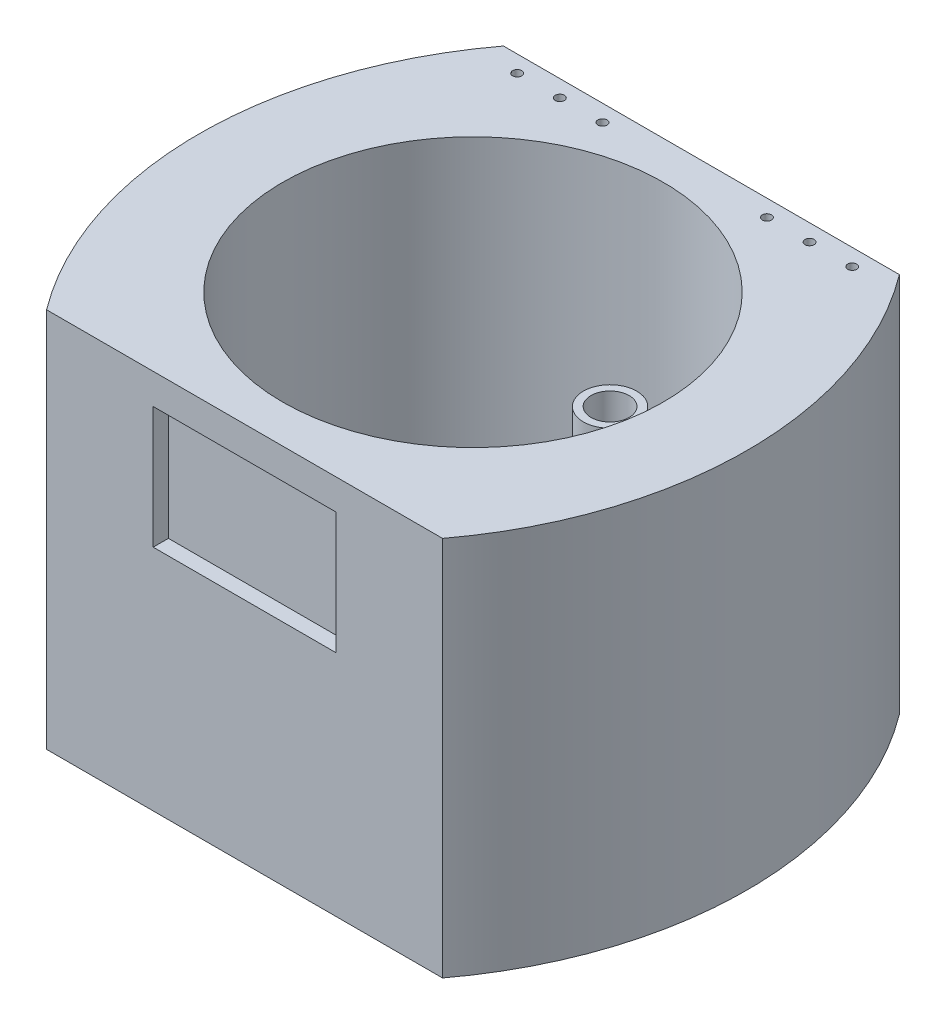
ISO-10303-21;
HEADER;
FILE_DESCRIPTION(('STEP AP214'),'2;1');
FILE_NAME('part.step','',(''),(''),'','','');
FILE_SCHEMA(('AUTOMOTIVE_DESIGN { 1 0 10303 214 1 1 1 1 }'));
ENDSEC;
DATA;
#1=APPLICATION_CONTEXT('core data for automotive mechanical design processes');
#2=APPLICATION_PROTOCOL_DEFINITION('international standard','automotive_design',2000,#1);
#3=PRODUCT_CONTEXT('',#1,'mechanical');
#4=PRODUCT('Part','Part','',(#3));
#5=PRODUCT_RELATED_PRODUCT_CATEGORY('part','',(#4));
#6=PRODUCT_DEFINITION_FORMATION('','',#4);
#7=PRODUCT_DEFINITION_CONTEXT('part definition',#1,'design');
#8=PRODUCT_DEFINITION('design','',#6,#7);
#9=PRODUCT_DEFINITION_SHAPE('','',#8);
#10=(LENGTH_UNIT() NAMED_UNIT(*) SI_UNIT(.MILLI.,.METRE.));
#11=(NAMED_UNIT(*) PLANE_ANGLE_UNIT() SI_UNIT($,.RADIAN.));
#12=(NAMED_UNIT(*) SI_UNIT($,.STERADIAN.) SOLID_ANGLE_UNIT());
#13=UNCERTAINTY_MEASURE_WITH_UNIT(LENGTH_MEASURE(1.E-05),#10,'distance_accuracy_value','');
#14=(GEOMETRIC_REPRESENTATION_CONTEXT(3) GLOBAL_UNCERTAINTY_ASSIGNED_CONTEXT((#13)) GLOBAL_UNIT_ASSIGNED_CONTEXT((#10,
#11,#12)) REPRESENTATION_CONTEXT('',''));
#15=CARTESIAN_POINT('',(0.,0.,0.));
#16=DIRECTION('',(0.,0.,1.));
#17=DIRECTION('',(1.,0.,0.));
#18=AXIS2_PLACEMENT_3D('',#15,#16,#17);
#19=CARTESIAN_POINT('',(70.,250.,0.));
#20=DIRECTION('',(0.,-1.,0.));
#21=DIRECTION('',(0.,0.,-1.));
#22=AXIS2_PLACEMENT_3D('',#19,#20,#21);
#23=CYLINDRICAL_SURFACE('',#22,250.);
#24=CARTESIAN_POINT('',(70.,0.,0.));
#25=DIRECTION('',(0.,1.,0.));
#26=DIRECTION('',(0.,0.,1.));
#27=AXIS2_PLACEMENT_3D('',#24,#25,#26);
#28=CIRCLE('',#27,250.);
#29=CARTESIAN_POINT('',(-130.,0.,-150.));
#30=VERTEX_POINT('',#29);
#31=CARTESIAN_POINT('',(-130.,0.,150.));
#32=VERTEX_POINT('',#31);
#33=EDGE_CURVE('E177',#30,#32,#28,.T.);
#34=ORIENTED_EDGE('',*,*,#33,.T.);
#35=DIRECTION('',(0.,-1.,0.));
#36=VECTOR('',#35,1.);
#37=CARTESIAN_POINT('',(-130.,250.,150.));
#38=LINE('',#37,#36);
#39=CARTESIAN_POINT('',(-130.,250.,150.));
#40=VERTEX_POINT('',#39);
#41=EDGE_CURVE('E11',#40,#32,#38,.T.);
#42=ORIENTED_EDGE('',*,*,#41,.F.);
#43=CARTESIAN_POINT('',(70.,250.,0.));
#44=DIRECTION('',(0.,1.,0.));
#45=DIRECTION('',(0.,0.,1.));
#46=AXIS2_PLACEMENT_3D('',#43,#44,#45);
#47=CIRCLE('',#46,250.);
#48=CARTESIAN_POINT('',(-130.,250.,-150.));
#49=VERTEX_POINT('',#48);
#50=EDGE_CURVE('E181',#49,#40,#47,.T.);
#51=ORIENTED_EDGE('',*,*,#50,.F.);
#52=DIRECTION('',(0.,-1.,0.));
#53=VECTOR('',#52,1.);
#54=CARTESIAN_POINT('',(-130.,250.,-150.));
#55=LINE('',#54,#53);
#56=EDGE_CURVE('E191',#49,#30,#55,.T.);
#57=ORIENTED_EDGE('',*,*,#56,.T.);
#58=EDGE_LOOP('',(#34,#42,#51,#57));
#59=FACE_BOUND('',#58,.T.);
#60=ADVANCED_FACE('F44',(#59),#23,.T.);
#61=CARTESIAN_POINT('',(-130.,250.,150.));
#62=DIRECTION('',(0.,0.,-1.));
#63=DIRECTION('',(-1.,0.,0.));
#64=AXIS2_PLACEMENT_3D('',#61,#62,#63);
#65=PLANE('',#64);
#66=DIRECTION('',(1.,0.,0.));
#67=VECTOR('',#66,1.);
#68=CARTESIAN_POINT('',(-59.9999999999986,150.,150.));
#69=LINE('',#68,#67);
#70=CARTESIAN_POINT('',(-59.9999999999986,150.,150.));
#71=VERTEX_POINT('',#70);
#72=CARTESIAN_POINT('',(60.0000000000014,150.,150.));
#73=VERTEX_POINT('',#72);
#74=EDGE_CURVE('E157',#71,#73,#69,.T.);
#75=ORIENTED_EDGE('',*,*,#74,.F.);
#76=DIRECTION('',(0.,-1.,0.));
#77=VECTOR('',#76,1.);
#78=CARTESIAN_POINT('',(-59.9999999999986,230.,150.));
#79=LINE('',#78,#77);
#80=CARTESIAN_POINT('',(-59.9999999999986,230.,150.));
#81=VERTEX_POINT('',#80);
#82=EDGE_CURVE('E59',#81,#71,#79,.T.);
#83=ORIENTED_EDGE('',*,*,#82,.F.);
#84=DIRECTION('',(-1.,0.,0.));
#85=VECTOR('',#84,1.);
#86=CARTESIAN_POINT('',(-59.9999999999986,230.,150.));
#87=LINE('',#86,#85);
#88=CARTESIAN_POINT('',(60.0000000000014,230.,150.));
#89=VERTEX_POINT('',#88);
#90=EDGE_CURVE('E141',#89,#81,#87,.T.);
#91=ORIENTED_EDGE('',*,*,#90,.F.);
#92=DIRECTION('',(0.,1.,0.));
#93=VECTOR('',#92,1.);
#94=CARTESIAN_POINT('',(60.0000000000014,230.,150.));
#95=LINE('',#94,#93);
#96=EDGE_CURVE('E145',#73,#89,#95,.T.);
#97=ORIENTED_EDGE('',*,*,#96,.F.);
#98=EDGE_LOOP('',(#75,#83,#91,#97));
#99=FACE_BOUND('',#98,.T.);
#100=DIRECTION('',(1.,0.,0.));
#101=VECTOR('',#100,1.);
#102=CARTESIAN_POINT('',(-130.,0.,150.));
#103=LINE('',#102,#101);
#104=CARTESIAN_POINT('',(130.,0.,150.));
#105=VERTEX_POINT('',#104);
#106=EDGE_CURVE('E195',#32,#105,#103,.T.);
#107=ORIENTED_EDGE('',*,*,#106,.T.);
#108=DIRECTION('',(0.,-1.,0.));
#109=VECTOR('',#108,1.);
#110=CARTESIAN_POINT('',(130.,250.,150.));
#111=LINE('',#110,#109);
#112=CARTESIAN_POINT('',(130.,250.,150.));
#113=VERTEX_POINT('',#112);
#114=EDGE_CURVE('E52',#113,#105,#111,.T.);
#115=ORIENTED_EDGE('',*,*,#114,.F.);
#116=DIRECTION('',(1.,0.,0.));
#117=VECTOR('',#116,1.);
#118=CARTESIAN_POINT('',(-130.,250.,150.));
#119=LINE('',#118,#117);
#120=EDGE_CURVE('E96',#40,#113,#119,.T.);
#121=ORIENTED_EDGE('',*,*,#120,.F.);
#122=ORIENTED_EDGE('',*,*,#41,.T.);
#123=EDGE_LOOP('',(#107,#115,#121,#122));
#124=FACE_BOUND('',#123,.T.);
#125=ADVANCED_FACE('F230',(#99,#124),#65,.F.);
#126=CARTESIAN_POINT('',(-70.,250.,0.));
#127=DIRECTION('',(0.,-1.,0.));
#128=DIRECTION('',(0.,0.,-1.));
#129=AXIS2_PLACEMENT_3D('',#126,#127,#128);
#130=CYLINDRICAL_SURFACE('',#129,250.);
#131=CARTESIAN_POINT('',(-70.,0.,0.));
#132=DIRECTION('',(0.,1.,0.));
#133=DIRECTION('',(0.,0.,-1.));
#134=AXIS2_PLACEMENT_3D('',#131,#132,#133);
#135=CIRCLE('',#134,250.);
#136=CARTESIAN_POINT('',(130.,0.,-150.));
#137=VERTEX_POINT('',#136);
#138=EDGE_CURVE('E198',#105,#137,#135,.T.);
#139=ORIENTED_EDGE('',*,*,#138,.T.);
#140=DIRECTION('',(0.,-1.,0.));
#141=VECTOR('',#140,1.);
#142=CARTESIAN_POINT('',(130.,250.,-150.));
#143=LINE('',#142,#141);
#144=CARTESIAN_POINT('',(130.,250.,-150.));
#145=VERTEX_POINT('',#144);
#146=EDGE_CURVE('E205',#145,#137,#143,.T.);
#147=ORIENTED_EDGE('',*,*,#146,.F.);
#148=CARTESIAN_POINT('',(-70.,250.,0.));
#149=DIRECTION('',(0.,1.,0.));
#150=DIRECTION('',(0.,0.,-1.));
#151=AXIS2_PLACEMENT_3D('',#148,#149,#150);
#152=CIRCLE('',#151,250.);
#153=EDGE_CURVE('E186',#113,#145,#152,.T.);
#154=ORIENTED_EDGE('',*,*,#153,.F.);
#155=ORIENTED_EDGE('',*,*,#114,.T.);
#156=EDGE_LOOP('',(#139,#147,#154,#155));
#157=FACE_BOUND('',#156,.T.);
#158=ADVANCED_FACE('F212',(#157),#130,.T.);
#159=CARTESIAN_POINT('',(-130.,250.,-150.));
#160=DIRECTION('',(0.,0.,1.));
#161=DIRECTION('',(1.,0.,0.));
#162=AXIS2_PLACEMENT_3D('',#159,#160,#161);
#163=PLANE('',#162);
#164=DIRECTION('',(-1.,0.,0.));
#165=VECTOR('',#164,1.);
#166=CARTESIAN_POINT('',(-130.,0.,-150.));
#167=LINE('',#166,#165);
#168=EDGE_CURVE('E89',#137,#30,#167,.T.);
#169=ORIENTED_EDGE('',*,*,#168,.T.);
#170=ORIENTED_EDGE('',*,*,#56,.F.);
#171=DIRECTION('',(-1.,0.,0.));
#172=VECTOR('',#171,1.);
#173=CARTESIAN_POINT('',(-130.,250.,-150.));
#174=LINE('',#173,#172);
#175=EDGE_CURVE('E68',#145,#49,#174,.T.);
#176=ORIENTED_EDGE('',*,*,#175,.F.);
#177=ORIENTED_EDGE('',*,*,#146,.T.);
#178=EDGE_LOOP('',(#169,#170,#176,#177));
#179=FACE_BOUND('',#178,.T.);
#180=ADVANCED_FACE('F220',(#179),#163,.F.);
#181=CARTESIAN_POINT('',(70.,250.,0.));
#182=DIRECTION('',(0.,1.,0.));
#183=DIRECTION('',(0.,0.,1.));
#184=AXIS2_PLACEMENT_3D('',#181,#182,#183);
#185=PLANE('',#184);
#186=CARTESIAN_POINT('',(-110.,250.,-139.));
#187=DIRECTION('',(0.,1.,0.));
#188=DIRECTION('',(0.,0.,1.));
#189=AXIS2_PLACEMENT_3D('',#186,#187,#188);
#190=CIRCLE('',#189,3.00000000000001);
#191=CARTESIAN_POINT('',(-110.,250.,-136.));
#192=VERTEX_POINT('',#191);
#193=EDGE_CURVE('E302',#192,#192,#190,.T.);
#194=ORIENTED_EDGE('',*,*,#193,.F.);
#195=EDGE_LOOP('',(#194));
#196=FACE_BOUND('',#195,.T.);
#197=CARTESIAN_POINT('',(-82.,250.,-139.));
#198=DIRECTION('',(0.,1.,0.));
#199=DIRECTION('',(0.,0.,1.));
#200=AXIS2_PLACEMENT_3D('',#197,#198,#199);
#201=CIRCLE('',#200,3.00000000000001);
#202=CARTESIAN_POINT('',(-82.,250.,-136.));
#203=VERTEX_POINT('',#202);
#204=EDGE_CURVE('E306',#203,#203,#201,.T.);
#205=ORIENTED_EDGE('',*,*,#204,.F.);
#206=EDGE_LOOP('',(#205));
#207=FACE_BOUND('',#206,.T.);
#208=CARTESIAN_POINT('',(-54.,250.,-139.));
#209=DIRECTION('',(0.,1.,0.));
#210=DIRECTION('',(0.,0.,1.));
#211=AXIS2_PLACEMENT_3D('',#208,#209,#210);
#212=CIRCLE('',#211,2.99999999999999);
#213=CARTESIAN_POINT('',(-54.,250.,-136.));
#214=VERTEX_POINT('',#213);
#215=EDGE_CURVE('E314',#214,#214,#212,.T.);
#216=ORIENTED_EDGE('',*,*,#215,.F.);
#217=EDGE_LOOP('',(#216));
#218=FACE_BOUND('',#217,.T.);
#219=CARTESIAN_POINT('',(54.,250.,-139.));
#220=DIRECTION('',(0.,1.,0.));
#221=DIRECTION('',(0.,0.,1.));
#222=AXIS2_PLACEMENT_3D('',#219,#220,#221);
#223=CIRCLE('',#222,3.00000000000001);
#224=CARTESIAN_POINT('',(54.,250.,-136.));
#225=VERTEX_POINT('',#224);
#226=EDGE_CURVE('E322',#225,#225,#223,.T.);
#227=ORIENTED_EDGE('',*,*,#226,.F.);
#228=EDGE_LOOP('',(#227));
#229=FACE_BOUND('',#228,.T.);
#230=CARTESIAN_POINT('',(82.,250.,-139.));
#231=DIRECTION('',(0.,1.,0.));
#232=DIRECTION('',(0.,0.,1.));
#233=AXIS2_PLACEMENT_3D('',#230,#231,#232);
#234=CIRCLE('',#233,3.00000000000001);
#235=CARTESIAN_POINT('',(82.,250.,-136.));
#236=VERTEX_POINT('',#235);
#237=EDGE_CURVE('E330',#236,#236,#234,.T.);
#238=ORIENTED_EDGE('',*,*,#237,.F.);
#239=EDGE_LOOP('',(#238));
#240=FACE_BOUND('',#239,.T.);
#241=CARTESIAN_POINT('',(110.,250.,-139.));
#242=DIRECTION('',(0.,1.,0.));
#243=DIRECTION('',(0.,0.,1.));
#244=AXIS2_PLACEMENT_3D('',#241,#242,#243);
#245=CIRCLE('',#244,3.00000000000001);
#246=CARTESIAN_POINT('',(110.,250.,-136.));
#247=VERTEX_POINT('',#246);
#248=EDGE_CURVE('E292',#247,#247,#245,.T.);
#249=ORIENTED_EDGE('',*,*,#248,.F.);
#250=EDGE_LOOP('',(#249));
#251=FACE_BOUND('',#250,.T.);
#252=CARTESIAN_POINT('',(0.,250.,0.));
#253=DIRECTION('',(0.,1.,0.));
#254=DIRECTION('',(0.,0.,1.));
#255=AXIS2_PLACEMENT_3D('',#252,#253,#254);
#256=CIRCLE('',#255,125.);
#257=CARTESIAN_POINT('',(0.,250.,125.));
#258=VERTEX_POINT('',#257);
#259=EDGE_CURVE('E167',#258,#258,#256,.T.);
#260=ORIENTED_EDGE('',*,*,#259,.F.);
#261=EDGE_LOOP('',(#260));
#262=FACE_BOUND('',#261,.T.);
#263=ORIENTED_EDGE('',*,*,#50,.T.);
#264=ORIENTED_EDGE('',*,*,#120,.T.);
#265=ORIENTED_EDGE('',*,*,#153,.T.);
#266=ORIENTED_EDGE('',*,*,#175,.T.);
#267=EDGE_LOOP('',(#263,#264,#265,#266));
#268=FACE_BOUND('',#267,.T.);
#269=ADVANCED_FACE('F222',(#196,#207,#218,#229,#240,#251,#262,#268),#185,.T.);
#270=CARTESIAN_POINT('',(70.,0.,0.));
#271=DIRECTION('',(0.,1.,0.));
#272=DIRECTION('',(0.,0.,1.));
#273=AXIS2_PLACEMENT_3D('',#270,#271,#272);
#274=PLANE('',#273);
#275=CARTESIAN_POINT('',(-82.5,0.,40.));
#276=DIRECTION('',(0.,1.,0.));
#277=DIRECTION('',(0.,0.,1.));
#278=AXIS2_PLACEMENT_3D('',#275,#276,#277);
#279=CIRCLE('',#278,3.50000000000001);
#280=CARTESIAN_POINT('',(-82.5,0.,43.5));
#281=VERTEX_POINT('',#280);
#282=EDGE_CURVE('E273',#281,#281,#279,.T.);
#283=ORIENTED_EDGE('',*,*,#282,.T.);
#284=EDGE_LOOP('',(#283));
#285=FACE_BOUND('',#284,.T.);
#286=CARTESIAN_POINT('',(37.5,0.,40.));
#287=DIRECTION('',(0.,1.,0.));
#288=DIRECTION('',(0.,0.,1.));
#289=AXIS2_PLACEMENT_3D('',#286,#287,#288);
#290=CIRCLE('',#289,3.5);
#291=CARTESIAN_POINT('',(37.5,0.,43.5));
#292=VERTEX_POINT('',#291);
#293=EDGE_CURVE('E277',#292,#292,#290,.T.);
#294=ORIENTED_EDGE('',*,*,#293,.T.);
#295=EDGE_LOOP('',(#294));
#296=FACE_BOUND('',#295,.T.);
#297=CARTESIAN_POINT('',(37.5,0.,-40.));
#298=DIRECTION('',(0.,1.,0.));
#299=DIRECTION('',(0.,0.,1.));
#300=AXIS2_PLACEMENT_3D('',#297,#298,#299);
#301=CIRCLE('',#300,3.5);
#302=CARTESIAN_POINT('',(37.5,0.,-36.5));
#303=VERTEX_POINT('',#302);
#304=EDGE_CURVE('E281',#303,#303,#301,.T.);
#305=ORIENTED_EDGE('',*,*,#304,.T.);
#306=EDGE_LOOP('',(#305));
#307=FACE_BOUND('',#306,.T.);
#308=CARTESIAN_POINT('',(-82.5,0.,-40.));
#309=DIRECTION('',(0.,1.,0.));
#310=DIRECTION('',(0.,0.,1.));
#311=AXIS2_PLACEMENT_3D('',#308,#309,#310);
#312=CIRCLE('',#311,3.50000000000001);
#313=CARTESIAN_POINT('',(-82.5,0.,-36.5));
#314=VERTEX_POINT('',#313);
#315=EDGE_CURVE('E284',#314,#314,#312,.T.);
#316=ORIENTED_EDGE('',*,*,#315,.T.);
#317=EDGE_LOOP('',(#316));
#318=FACE_BOUND('',#317,.T.);
#319=ORIENTED_EDGE('',*,*,#33,.F.);
#320=ORIENTED_EDGE('',*,*,#168,.F.);
#321=ORIENTED_EDGE('',*,*,#138,.F.);
#322=ORIENTED_EDGE('',*,*,#106,.F.);
#323=EDGE_LOOP('',(#319,#320,#321,#322));
#324=FACE_BOUND('',#323,.T.);
#325=ADVANCED_FACE('F216',(#285,#296,#307,#318,#324),#274,.F.);
#326=CARTESIAN_POINT('',(0.,10.,0.));
#327=DIRECTION('',(0.,1.,0.));
#328=DIRECTION('',(0.,0.,1.));
#329=AXIS2_PLACEMENT_3D('',#326,#327,#328);
#330=CYLINDRICAL_SURFACE('',#329,125.);
#331=CARTESIAN_POINT('',(0.,10.,0.));
#332=DIRECTION('',(0.,1.,0.));
#333=DIRECTION('',(0.,0.,1.));
#334=AXIS2_PLACEMENT_3D('',#331,#332,#333);
#335=CIRCLE('',#334,125.);
#336=CARTESIAN_POINT('',(0.,10.,125.));
#337=VERTEX_POINT('',#336);
#338=EDGE_CURVE('E173',#337,#337,#335,.T.);
#339=ORIENTED_EDGE('',*,*,#338,.F.);
#340=EDGE_LOOP('',(#339));
#341=FACE_BOUND('',#340,.T.);
#342=ORIENTED_EDGE('',*,*,#259,.T.);
#343=EDGE_LOOP('',(#342));
#344=FACE_BOUND('',#343,.T.);
#345=ADVANCED_FACE('F262',(#341,#344),#330,.F.);
#346=CARTESIAN_POINT('',(0.,10.,0.));
#347=DIRECTION('',(0.,1.,0.));
#348=DIRECTION('',(0.,0.,1.));
#349=AXIS2_PLACEMENT_3D('',#346,#347,#348);
#350=PLANE('',#349);
#351=CARTESIAN_POINT('',(0.,10.,90.));
#352=DIRECTION('',(0.,1.,0.));
#353=DIRECTION('',(0.,0.,1.));
#354=AXIS2_PLACEMENT_3D('',#351,#352,#353);
#355=CIRCLE('',#354,17.5);
#356=CARTESIAN_POINT('',(0.,10.,107.5));
#357=VERTEX_POINT('',#356);
#358=EDGE_CURVE('E455',#357,#357,#355,.T.);
#359=ORIENTED_EDGE('',*,*,#358,.F.);
#360=EDGE_LOOP('',(#359));
#361=FACE_BOUND('',#360,.T.);
#362=CARTESIAN_POINT('',(0.,10.,-90.));
#363=DIRECTION('',(0.,1.,0.));
#364=DIRECTION('',(0.,0.,1.));
#365=AXIS2_PLACEMENT_3D('',#362,#363,#364);
#366=CIRCLE('',#365,17.5);
#367=CARTESIAN_POINT('',(0.,10.,-72.5));
#368=VERTEX_POINT('',#367);
#369=EDGE_CURVE('E470',#368,#368,#366,.T.);
#370=ORIENTED_EDGE('',*,*,#369,.F.);
#371=EDGE_LOOP('',(#370));
#372=FACE_BOUND('',#371,.T.);
#373=CARTESIAN_POINT('',(-82.5,10.,40.));
#374=DIRECTION('',(0.,1.,0.));
#375=DIRECTION('',(0.,0.,1.));
#376=AXIS2_PLACEMENT_3D('',#373,#374,#375);
#377=CIRCLE('',#376,3.50000000000001);
#378=CARTESIAN_POINT('',(-82.5,10.,43.5));
#379=VERTEX_POINT('',#378);
#380=EDGE_CURVE('E489',#379,#379,#377,.T.);
#381=ORIENTED_EDGE('',*,*,#380,.F.);
#382=EDGE_LOOP('',(#381));
#383=FACE_BOUND('',#382,.T.);
#384=CARTESIAN_POINT('',(37.5,10.,40.));
#385=DIRECTION('',(0.,1.,0.));
#386=DIRECTION('',(0.,0.,1.));
#387=AXIS2_PLACEMENT_3D('',#384,#385,#386);
#388=CIRCLE('',#387,3.5);
#389=CARTESIAN_POINT('',(37.5,10.,43.5));
#390=VERTEX_POINT('',#389);
#391=EDGE_CURVE('E484',#390,#390,#388,.T.);
#392=ORIENTED_EDGE('',*,*,#391,.F.);
#393=EDGE_LOOP('',(#392));
#394=FACE_BOUND('',#393,.T.);
#395=CARTESIAN_POINT('',(37.5,10.,-40.));
#396=DIRECTION('',(0.,1.,0.));
#397=DIRECTION('',(0.,0.,1.));
#398=AXIS2_PLACEMENT_3D('',#395,#396,#397);
#399=CIRCLE('',#398,3.5);
#400=CARTESIAN_POINT('',(37.5,10.,-36.5));
#401=VERTEX_POINT('',#400);
#402=EDGE_CURVE('E294',#401,#401,#399,.T.);
#403=ORIENTED_EDGE('',*,*,#402,.F.);
#404=EDGE_LOOP('',(#403));
#405=FACE_BOUND('',#404,.T.);
#406=CARTESIAN_POINT('',(-82.5,10.,-40.));
#407=DIRECTION('',(0.,1.,0.));
#408=DIRECTION('',(0.,0.,1.));
#409=AXIS2_PLACEMENT_3D('',#406,#407,#408);
#410=CIRCLE('',#409,3.50000000000001);
#411=CARTESIAN_POINT('',(-82.5,10.,-36.5));
#412=VERTEX_POINT('',#411);
#413=EDGE_CURVE('E287',#412,#412,#410,.T.);
#414=ORIENTED_EDGE('',*,*,#413,.F.);
#415=EDGE_LOOP('',(#414));
#416=FACE_BOUND('',#415,.T.);
#417=ORIENTED_EDGE('',*,*,#338,.T.);
#418=EDGE_LOOP('',(#417));
#419=FACE_BOUND('',#418,.T.);
#420=ADVANCED_FACE('F253',(#361,#372,#383,#394,#405,#416,#419),#350,.T.);
#421=CARTESIAN_POINT('',(-59.9999999999986,230.,140.));
#422=DIRECTION('',(-1.,0.,0.));
#423=DIRECTION('',(0.,-1.,0.));
#424=AXIS2_PLACEMENT_3D('',#421,#422,#423);
#425=PLANE('',#424);
#426=ORIENTED_EDGE('',*,*,#82,.T.);
#427=DIRECTION('',(0.,0.,1.));
#428=VECTOR('',#427,1.);
#429=CARTESIAN_POINT('',(-59.9999999999986,150.,140.));
#430=LINE('',#429,#428);
#431=CARTESIAN_POINT('',(-59.9999999999986,150.,140.));
#432=VERTEX_POINT('',#431);
#433=EDGE_CURVE('E116',#432,#71,#430,.T.);
#434=ORIENTED_EDGE('',*,*,#433,.F.);
#435=DIRECTION('',(0.,-1.,0.));
#436=VECTOR('',#435,1.);
#437=CARTESIAN_POINT('',(-59.9999999999986,230.,140.));
#438=LINE('',#437,#436);
#439=CARTESIAN_POINT('',(-59.9999999999986,230.,140.));
#440=VERTEX_POINT('',#439);
#441=EDGE_CURVE('E120',#440,#432,#438,.T.);
#442=ORIENTED_EDGE('',*,*,#441,.F.);
#443=DIRECTION('',(0.,0.,1.));
#444=VECTOR('',#443,1.);
#445=CARTESIAN_POINT('',(-59.9999999999986,230.,140.));
#446=LINE('',#445,#444);
#447=EDGE_CURVE('E164',#440,#81,#446,.T.);
#448=ORIENTED_EDGE('',*,*,#447,.T.);
#449=EDGE_LOOP('',(#426,#434,#442,#448));
#450=FACE_BOUND('',#449,.T.);
#451=ADVANCED_FACE('F118',(#450),#425,.F.);
#452=CARTESIAN_POINT('',(-59.9999999999986,230.,140.));
#453=DIRECTION('',(0.,1.,0.));
#454=DIRECTION('',(0.,0.,1.));
#455=AXIS2_PLACEMENT_3D('',#452,#453,#454);
#456=PLANE('',#455);
#457=ORIENTED_EDGE('',*,*,#90,.T.);
#458=ORIENTED_EDGE('',*,*,#447,.F.);
#459=DIRECTION('',(-1.,0.,0.));
#460=VECTOR('',#459,1.);
#461=CARTESIAN_POINT('',(-59.9999999999986,230.,140.));
#462=LINE('',#461,#460);
#463=CARTESIAN_POINT('',(60.0000000000014,230.,140.));
#464=VERTEX_POINT('',#463);
#465=EDGE_CURVE('E127',#464,#440,#462,.T.);
#466=ORIENTED_EDGE('',*,*,#465,.F.);
#467=DIRECTION('',(0.,0.,1.));
#468=VECTOR('',#467,1.);
#469=CARTESIAN_POINT('',(60.0000000000014,230.,140.));
#470=LINE('',#469,#468);
#471=EDGE_CURVE('E168',#464,#89,#470,.T.);
#472=ORIENTED_EDGE('',*,*,#471,.T.);
#473=EDGE_LOOP('',(#457,#458,#466,#472));
#474=FACE_BOUND('',#473,.T.);
#475=ADVANCED_FACE('F245',(#474),#456,.F.);
#476=CARTESIAN_POINT('',(60.0000000000014,230.,140.));
#477=DIRECTION('',(1.,0.,0.));
#478=DIRECTION('',(0.,1.,0.));
#479=AXIS2_PLACEMENT_3D('',#476,#477,#478);
#480=PLANE('',#479);
#481=ORIENTED_EDGE('',*,*,#96,.T.);
#482=ORIENTED_EDGE('',*,*,#471,.F.);
#483=DIRECTION('',(0.,1.,0.));
#484=VECTOR('',#483,1.);
#485=CARTESIAN_POINT('',(60.0000000000014,230.,140.));
#486=LINE('',#485,#484);
#487=CARTESIAN_POINT('',(60.0000000000014,150.,140.));
#488=VERTEX_POINT('',#487);
#489=EDGE_CURVE('E136',#488,#464,#486,.T.);
#490=ORIENTED_EDGE('',*,*,#489,.F.);
#491=DIRECTION('',(0.,0.,1.));
#492=VECTOR('',#491,1.);
#493=CARTESIAN_POINT('',(60.0000000000014,150.,140.));
#494=LINE('',#493,#492);
#495=EDGE_CURVE('E126',#488,#73,#494,.T.);
#496=ORIENTED_EDGE('',*,*,#495,.T.);
#497=EDGE_LOOP('',(#481,#482,#490,#496));
#498=FACE_BOUND('',#497,.T.);
#499=ADVANCED_FACE('F243',(#498),#480,.F.);
#500=CARTESIAN_POINT('',(-59.9999999999986,150.,140.));
#501=DIRECTION('',(0.,-1.,0.));
#502=DIRECTION('',(0.,0.,-1.));
#503=AXIS2_PLACEMENT_3D('',#500,#501,#502);
#504=PLANE('',#503);
#505=ORIENTED_EDGE('',*,*,#74,.T.);
#506=ORIENTED_EDGE('',*,*,#495,.F.);
#507=DIRECTION('',(1.,0.,0.));
#508=VECTOR('',#507,1.);
#509=CARTESIAN_POINT('',(-59.9999999999986,150.,140.));
#510=LINE('',#509,#508);
#511=EDGE_CURVE('E130',#432,#488,#510,.T.);
#512=ORIENTED_EDGE('',*,*,#511,.F.);
#513=ORIENTED_EDGE('',*,*,#433,.T.);
#514=EDGE_LOOP('',(#505,#506,#512,#513));
#515=FACE_BOUND('',#514,.T.);
#516=ADVANCED_FACE('F131',(#515),#504,.F.);
#517=CARTESIAN_POINT('',(0.,0.,140.));
#518=DIRECTION('',(0.,0.,1.));
#519=DIRECTION('',(1.,0.,0.));
#520=AXIS2_PLACEMENT_3D('',#517,#518,#519);
#521=PLANE('',#520);
#522=ORIENTED_EDGE('',*,*,#441,.T.);
#523=ORIENTED_EDGE('',*,*,#511,.T.);
#524=ORIENTED_EDGE('',*,*,#489,.T.);
#525=ORIENTED_EDGE('',*,*,#465,.T.);
#526=EDGE_LOOP('',(#522,#523,#524,#525));
#527=FACE_BOUND('',#526,.T.);
#528=ADVANCED_FACE('F138',(#527),#521,.T.);
#529=CARTESIAN_POINT('',(110.,230.,-139.));
#530=DIRECTION('',(0.,1.,0.));
#531=DIRECTION('',(0.,0.,1.));
#532=AXIS2_PLACEMENT_3D('',#529,#530,#531);
#533=CYLINDRICAL_SURFACE('',#532,3.00000000000001);
#534=CARTESIAN_POINT('',(110.,230.,-139.));
#535=DIRECTION('',(0.,1.,0.));
#536=DIRECTION('',(0.,0.,1.));
#537=AXIS2_PLACEMENT_3D('',#534,#535,#536);
#538=CIRCLE('',#537,3.00000000000001);
#539=CARTESIAN_POINT('',(110.,230.,-136.));
#540=VERTEX_POINT('',#539);
#541=EDGE_CURVE('E148',#540,#540,#538,.T.);
#542=ORIENTED_EDGE('',*,*,#541,.F.);
#543=EDGE_LOOP('',(#542));
#544=FACE_BOUND('',#543,.T.);
#545=ORIENTED_EDGE('',*,*,#248,.T.);
#546=EDGE_LOOP('',(#545));
#547=FACE_BOUND('',#546,.T.);
#548=ADVANCED_FACE('F341',(#544,#547),#533,.F.);
#549=CARTESIAN_POINT('',(110.,230.,-139.));
#550=DIRECTION('',(0.,1.,0.));
#551=DIRECTION('',(0.,0.,1.));
#552=AXIS2_PLACEMENT_3D('',#549,#550,#551);
#553=PLANE('',#552);
#554=ORIENTED_EDGE('',*,*,#541,.T.);
#555=EDGE_LOOP('',(#554));
#556=FACE_BOUND('',#555,.T.);
#557=ADVANCED_FACE('F347',(#556),#553,.T.);
#558=CARTESIAN_POINT('',(82.,230.,-139.));
#559=DIRECTION('',(0.,1.,0.));
#560=DIRECTION('',(0.,0.,1.));
#561=AXIS2_PLACEMENT_3D('',#558,#559,#560);
#562=CYLINDRICAL_SURFACE('',#561,3.00000000000001);
#563=CARTESIAN_POINT('',(82.,230.,-139.));
#564=DIRECTION('',(0.,1.,0.));
#565=DIRECTION('',(0.,0.,1.));
#566=AXIS2_PLACEMENT_3D('',#563,#564,#565);
#567=CIRCLE('',#566,3.00000000000001);
#568=CARTESIAN_POINT('',(82.,230.,-136.));
#569=VERTEX_POINT('',#568);
#570=EDGE_CURVE('E334',#569,#569,#567,.T.);
#571=ORIENTED_EDGE('',*,*,#570,.F.);
#572=EDGE_LOOP('',(#571));
#573=FACE_BOUND('',#572,.T.);
#574=ORIENTED_EDGE('',*,*,#237,.T.);
#575=EDGE_LOOP('',(#574));
#576=FACE_BOUND('',#575,.T.);
#577=ADVANCED_FACE('F354',(#573,#576),#562,.F.);
#578=CARTESIAN_POINT('',(82.,230.,-139.));
#579=DIRECTION('',(0.,1.,0.));
#580=DIRECTION('',(0.,0.,1.));
#581=AXIS2_PLACEMENT_3D('',#578,#579,#580);
#582=PLANE('',#581);
#583=ORIENTED_EDGE('',*,*,#570,.T.);
#584=EDGE_LOOP('',(#583));
#585=FACE_BOUND('',#584,.T.);
#586=ADVANCED_FACE('F358',(#585),#582,.T.);
#587=CARTESIAN_POINT('',(54.,230.,-139.));
#588=DIRECTION('',(0.,1.,0.));
#589=DIRECTION('',(0.,0.,1.));
#590=AXIS2_PLACEMENT_3D('',#587,#588,#589);
#591=CYLINDRICAL_SURFACE('',#590,3.00000000000001);
#592=CARTESIAN_POINT('',(54.,230.,-139.));
#593=DIRECTION('',(0.,1.,0.));
#594=DIRECTION('',(0.,0.,1.));
#595=AXIS2_PLACEMENT_3D('',#592,#593,#594);
#596=CIRCLE('',#595,3.00000000000001);
#597=CARTESIAN_POINT('',(54.,230.,-136.));
#598=VERTEX_POINT('',#597);
#599=EDGE_CURVE('E326',#598,#598,#596,.T.);
#600=ORIENTED_EDGE('',*,*,#599,.F.);
#601=EDGE_LOOP('',(#600));
#602=FACE_BOUND('',#601,.T.);
#603=ORIENTED_EDGE('',*,*,#226,.T.);
#604=EDGE_LOOP('',(#603));
#605=FACE_BOUND('',#604,.T.);
#606=ADVANCED_FACE('F361',(#602,#605),#591,.F.);
#607=CARTESIAN_POINT('',(54.,230.,-139.));
#608=DIRECTION('',(0.,1.,0.));
#609=DIRECTION('',(0.,0.,1.));
#610=AXIS2_PLACEMENT_3D('',#607,#608,#609);
#611=PLANE('',#610);
#612=ORIENTED_EDGE('',*,*,#599,.T.);
#613=EDGE_LOOP('',(#612));
#614=FACE_BOUND('',#613,.T.);
#615=ADVANCED_FACE('F366',(#614),#611,.T.);
#616=CARTESIAN_POINT('',(-54.,230.,-139.));
#617=DIRECTION('',(0.,1.,0.));
#618=DIRECTION('',(0.,0.,1.));
#619=AXIS2_PLACEMENT_3D('',#616,#617,#618);
#620=CYLINDRICAL_SURFACE('',#619,2.99999999999999);
#621=CARTESIAN_POINT('',(-54.,230.,-139.));
#622=DIRECTION('',(0.,1.,0.));
#623=DIRECTION('',(0.,0.,1.));
#624=AXIS2_PLACEMENT_3D('',#621,#622,#623);
#625=CIRCLE('',#624,2.99999999999999);
#626=CARTESIAN_POINT('',(-54.,230.,-136.));
#627=VERTEX_POINT('',#626);
#628=EDGE_CURVE('E318',#627,#627,#625,.T.);
#629=ORIENTED_EDGE('',*,*,#628,.F.);
#630=EDGE_LOOP('',(#629));
#631=FACE_BOUND('',#630,.T.);
#632=ORIENTED_EDGE('',*,*,#215,.T.);
#633=EDGE_LOOP('',(#632));
#634=FACE_BOUND('',#633,.T.);
#635=ADVANCED_FACE('F369',(#631,#634),#620,.F.);
#636=CARTESIAN_POINT('',(-54.,230.,-139.));
#637=DIRECTION('',(0.,1.,0.));
#638=DIRECTION('',(0.,0.,1.));
#639=AXIS2_PLACEMENT_3D('',#636,#637,#638);
#640=PLANE('',#639);
#641=ORIENTED_EDGE('',*,*,#628,.T.);
#642=EDGE_LOOP('',(#641));
#643=FACE_BOUND('',#642,.T.);
#644=ADVANCED_FACE('F374',(#643),#640,.T.);
#645=CARTESIAN_POINT('',(-82.,230.,-139.));
#646=DIRECTION('',(0.,1.,0.));
#647=DIRECTION('',(0.,0.,1.));
#648=AXIS2_PLACEMENT_3D('',#645,#646,#647);
#649=CYLINDRICAL_SURFACE('',#648,3.00000000000001);
#650=CARTESIAN_POINT('',(-82.,230.,-139.));
#651=DIRECTION('',(0.,1.,0.));
#652=DIRECTION('',(0.,0.,1.));
#653=AXIS2_PLACEMENT_3D('',#650,#651,#652);
#654=CIRCLE('',#653,3.00000000000001);
#655=CARTESIAN_POINT('',(-82.,230.,-136.));
#656=VERTEX_POINT('',#655);
#657=EDGE_CURVE('E310',#656,#656,#654,.T.);
#658=ORIENTED_EDGE('',*,*,#657,.F.);
#659=EDGE_LOOP('',(#658));
#660=FACE_BOUND('',#659,.T.);
#661=ORIENTED_EDGE('',*,*,#204,.T.);
#662=EDGE_LOOP('',(#661));
#663=FACE_BOUND('',#662,.T.);
#664=ADVANCED_FACE('F377',(#660,#663),#649,.F.);
#665=CARTESIAN_POINT('',(-82.,230.,-139.));
#666=DIRECTION('',(0.,1.,0.));
#667=DIRECTION('',(0.,0.,1.));
#668=AXIS2_PLACEMENT_3D('',#665,#666,#667);
#669=PLANE('',#668);
#670=ORIENTED_EDGE('',*,*,#657,.T.);
#671=EDGE_LOOP('',(#670));
#672=FACE_BOUND('',#671,.T.);
#673=ADVANCED_FACE('F382',(#672),#669,.T.);
#674=CARTESIAN_POINT('',(-110.,230.,-139.));
#675=DIRECTION('',(0.,1.,0.));
#676=DIRECTION('',(0.,0.,1.));
#677=AXIS2_PLACEMENT_3D('',#674,#675,#676);
#678=CYLINDRICAL_SURFACE('',#677,3.00000000000001);
#679=CARTESIAN_POINT('',(-110.,230.,-139.));
#680=DIRECTION('',(0.,1.,0.));
#681=DIRECTION('',(0.,0.,1.));
#682=AXIS2_PLACEMENT_3D('',#679,#680,#681);
#683=CIRCLE('',#682,3.00000000000001);
#684=CARTESIAN_POINT('',(-110.,230.,-136.));
#685=VERTEX_POINT('',#684);
#686=EDGE_CURVE('E158',#685,#685,#683,.T.);
#687=ORIENTED_EDGE('',*,*,#686,.F.);
#688=EDGE_LOOP('',(#687));
#689=FACE_BOUND('',#688,.T.);
#690=ORIENTED_EDGE('',*,*,#193,.T.);
#691=EDGE_LOOP('',(#690));
#692=FACE_BOUND('',#691,.T.);
#693=ADVANCED_FACE('F385',(#689,#692),#678,.F.);
#694=CARTESIAN_POINT('',(-110.,230.,-139.));
#695=DIRECTION('',(0.,1.,0.));
#696=DIRECTION('',(0.,0.,1.));
#697=AXIS2_PLACEMENT_3D('',#694,#695,#696);
#698=PLANE('',#697);
#699=ORIENTED_EDGE('',*,*,#686,.T.);
#700=EDGE_LOOP('',(#699));
#701=FACE_BOUND('',#700,.T.);
#702=ADVANCED_FACE('F392',(#701),#698,.T.);
#703=CARTESIAN_POINT('',(-82.5,0.,-40.));
#704=DIRECTION('',(0.,1.,0.));
#705=DIRECTION('',(0.,0.,1.));
#706=AXIS2_PLACEMENT_3D('',#703,#704,#705);
#707=CYLINDRICAL_SURFACE('',#706,3.50000000000001);
#708=ORIENTED_EDGE('',*,*,#315,.F.);
#709=EDGE_LOOP('',(#708));
#710=FACE_BOUND('',#709,.T.);
#711=ORIENTED_EDGE('',*,*,#413,.T.);
#712=EDGE_LOOP('',(#711));
#713=FACE_BOUND('',#712,.T.);
#714=ADVANCED_FACE('F396',(#710,#713),#707,.F.);
#715=CARTESIAN_POINT('',(37.5,0.,-40.));
#716=DIRECTION('',(0.,1.,0.));
#717=DIRECTION('',(0.,0.,1.));
#718=AXIS2_PLACEMENT_3D('',#715,#716,#717);
#719=CYLINDRICAL_SURFACE('',#718,3.5);
#720=ORIENTED_EDGE('',*,*,#304,.F.);
#721=EDGE_LOOP('',(#720));
#722=FACE_BOUND('',#721,.T.);
#723=ORIENTED_EDGE('',*,*,#402,.T.);
#724=EDGE_LOOP('',(#723));
#725=FACE_BOUND('',#724,.T.);
#726=ADVANCED_FACE('F400',(#722,#725),#719,.F.);
#727=CARTESIAN_POINT('',(37.5,0.,40.));
#728=DIRECTION('',(0.,1.,0.));
#729=DIRECTION('',(0.,0.,1.));
#730=AXIS2_PLACEMENT_3D('',#727,#728,#729);
#731=CYLINDRICAL_SURFACE('',#730,3.5);
#732=ORIENTED_EDGE('',*,*,#293,.F.);
#733=EDGE_LOOP('',(#732));
#734=FACE_BOUND('',#733,.T.);
#735=ORIENTED_EDGE('',*,*,#391,.T.);
#736=EDGE_LOOP('',(#735));
#737=FACE_BOUND('',#736,.T.);
#738=ADVANCED_FACE('F405',(#734,#737),#731,.F.);
#739=CARTESIAN_POINT('',(-82.5,0.,40.));
#740=DIRECTION('',(0.,1.,0.));
#741=DIRECTION('',(0.,0.,1.));
#742=AXIS2_PLACEMENT_3D('',#739,#740,#741);
#743=CYLINDRICAL_SURFACE('',#742,3.50000000000001);
#744=ORIENTED_EDGE('',*,*,#282,.F.);
#745=EDGE_LOOP('',(#744));
#746=FACE_BOUND('',#745,.T.);
#747=ORIENTED_EDGE('',*,*,#380,.T.);
#748=EDGE_LOOP('',(#747));
#749=FACE_BOUND('',#748,.T.);
#750=ADVANCED_FACE('F401',(#746,#749),#743,.F.);
#751=CARTESIAN_POINT('',(0.,140.,-90.));
#752=DIRECTION('',(0.,-1.,0.));
#753=DIRECTION('',(0.,0.,-1.));
#754=AXIS2_PLACEMENT_3D('',#751,#752,#753);
#755=CYLINDRICAL_SURFACE('',#754,17.5);
#756=CARTESIAN_POINT('',(0.,140.,-90.));
#757=DIRECTION('',(0.,1.,0.));
#758=DIRECTION('',(0.,0.,1.));
#759=AXIS2_PLACEMENT_3D('',#756,#757,#758);
#760=CIRCLE('',#759,17.5);
#761=CARTESIAN_POINT('',(0.,140.,-72.5));
#762=VERTEX_POINT('',#761);
#763=EDGE_CURVE('E472',#762,#762,#760,.T.);
#764=ORIENTED_EDGE('',*,*,#763,.F.);
#765=EDGE_LOOP('',(#764));
#766=FACE_BOUND('',#765,.T.);
#767=ORIENTED_EDGE('',*,*,#369,.T.);
#768=EDGE_LOOP('',(#767));
#769=FACE_BOUND('',#768,.T.);
#770=ADVANCED_FACE('F404',(#766,#769),#755,.T.);
#771=CARTESIAN_POINT('',(0.,140.,-90.));
#772=DIRECTION('',(0.,1.,0.));
#773=DIRECTION('',(0.,0.,1.));
#774=AXIS2_PLACEMENT_3D('',#771,#772,#773);
#775=PLANE('',#774);
#776=CARTESIAN_POINT('',(0.,140.,-90.));
#777=DIRECTION('',(0.,1.,0.));
#778=DIRECTION('',(0.,0.,1.));
#779=AXIS2_PLACEMENT_3D('',#776,#777,#778);
#780=CIRCLE('',#779,12.5);
#781=CARTESIAN_POINT('',(0.,140.,-77.5));
#782=VERTEX_POINT('',#781);
#783=EDGE_CURVE('E458',#782,#782,#780,.T.);
#784=ORIENTED_EDGE('',*,*,#783,.F.);
#785=EDGE_LOOP('',(#784));
#786=FACE_BOUND('',#785,.T.);
#787=ORIENTED_EDGE('',*,*,#763,.T.);
#788=EDGE_LOOP('',(#787));
#789=FACE_BOUND('',#788,.T.);
#790=ADVANCED_FACE('F415',(#786,#789),#775,.T.);
#791=CARTESIAN_POINT('',(0.,140.,90.));
#792=DIRECTION('',(0.,-1.,0.));
#793=DIRECTION('',(0.,0.,-1.));
#794=AXIS2_PLACEMENT_3D('',#791,#792,#793);
#795=CYLINDRICAL_SURFACE('',#794,17.5);
#796=CARTESIAN_POINT('',(0.,140.,90.));
#797=DIRECTION('',(0.,1.,0.));
#798=DIRECTION('',(0.,0.,1.));
#799=AXIS2_PLACEMENT_3D('',#796,#797,#798);
#800=CIRCLE('',#799,17.5);
#801=CARTESIAN_POINT('',(0.,140.,107.5));
#802=VERTEX_POINT('',#801);
#803=EDGE_CURVE('E449',#802,#802,#800,.T.);
#804=ORIENTED_EDGE('',*,*,#803,.F.);
#805=EDGE_LOOP('',(#804));
#806=FACE_BOUND('',#805,.T.);
#807=ORIENTED_EDGE('',*,*,#358,.T.);
#808=EDGE_LOOP('',(#807));
#809=FACE_BOUND('',#808,.T.);
#810=ADVANCED_FACE('F419',(#806,#809),#795,.T.);
#811=CARTESIAN_POINT('',(0.,140.,90.));
#812=DIRECTION('',(0.,1.,0.));
#813=DIRECTION('',(0.,0.,1.));
#814=AXIS2_PLACEMENT_3D('',#811,#812,#813);
#815=PLANE('',#814);
#816=CARTESIAN_POINT('',(0.,140.,90.));
#817=DIRECTION('',(0.,1.,0.));
#818=DIRECTION('',(0.,0.,1.));
#819=AXIS2_PLACEMENT_3D('',#816,#817,#818);
#820=CIRCLE('',#819,12.5);
#821=CARTESIAN_POINT('',(0.,140.,102.5));
#822=VERTEX_POINT('',#821);
#823=EDGE_CURVE('E450',#822,#822,#820,.T.);
#824=ORIENTED_EDGE('',*,*,#823,.F.);
#825=EDGE_LOOP('',(#824));
#826=FACE_BOUND('',#825,.T.);
#827=ORIENTED_EDGE('',*,*,#803,.T.);
#828=EDGE_LOOP('',(#827));
#829=FACE_BOUND('',#828,.T.);
#830=ADVANCED_FACE('F421',(#826,#829),#815,.T.);
#831=CARTESIAN_POINT('',(0.,90.,90.));
#832=DIRECTION('',(0.,1.,0.));
#833=DIRECTION('',(0.,0.,1.));
#834=AXIS2_PLACEMENT_3D('',#831,#832,#833);
#835=CYLINDRICAL_SURFACE('',#834,12.5);
#836=CARTESIAN_POINT('',(0.,90.,90.));
#837=DIRECTION('',(0.,1.,0.));
#838=DIRECTION('',(0.,0.,1.));
#839=AXIS2_PLACEMENT_3D('',#836,#837,#838);
#840=CIRCLE('',#839,12.5);
#841=CARTESIAN_POINT('',(0.,90.,102.5));
#842=VERTEX_POINT('',#841);
#843=EDGE_CURVE('E447',#842,#842,#840,.T.);
#844=ORIENTED_EDGE('',*,*,#843,.F.);
#845=EDGE_LOOP('',(#844));
#846=FACE_BOUND('',#845,.T.);
#847=ORIENTED_EDGE('',*,*,#823,.T.);
#848=EDGE_LOOP('',(#847));
#849=FACE_BOUND('',#848,.T.);
#850=ADVANCED_FACE('F424',(#846,#849),#835,.F.);
#851=CARTESIAN_POINT('',(0.,90.,90.));
#852=DIRECTION('',(0.,1.,0.));
#853=DIRECTION('',(0.,0.,1.));
#854=AXIS2_PLACEMENT_3D('',#851,#852,#853);
#855=PLANE('',#854);
#856=ORIENTED_EDGE('',*,*,#843,.T.);
#857=EDGE_LOOP('',(#856));
#858=FACE_BOUND('',#857,.T.);
#859=ADVANCED_FACE('F436',(#858),#855,.T.);
#860=CARTESIAN_POINT('',(0.,90.,-90.));
#861=DIRECTION('',(0.,1.,0.));
#862=DIRECTION('',(0.,0.,1.));
#863=AXIS2_PLACEMENT_3D('',#860,#861,#862);
#864=CYLINDRICAL_SURFACE('',#863,12.5);
#865=CARTESIAN_POINT('',(0.,90.,-90.));
#866=DIRECTION('',(0.,1.,0.));
#867=DIRECTION('',(0.,0.,1.));
#868=AXIS2_PLACEMENT_3D('',#865,#866,#867);
#869=CIRCLE('',#868,12.5);
#870=CARTESIAN_POINT('',(0.,90.,-77.5));
#871=VERTEX_POINT('',#870);
#872=EDGE_CURVE('E464',#871,#871,#869,.T.);
#873=ORIENTED_EDGE('',*,*,#872,.F.);
#874=EDGE_LOOP('',(#873));
#875=FACE_BOUND('',#874,.T.);
#876=ORIENTED_EDGE('',*,*,#783,.T.);
#877=EDGE_LOOP('',(#876));
#878=FACE_BOUND('',#877,.T.);
#879=ADVANCED_FACE('F432',(#875,#878),#864,.F.);
#880=CARTESIAN_POINT('',(0.,90.,-90.));
#881=DIRECTION('',(0.,1.,0.));
#882=DIRECTION('',(0.,0.,1.));
#883=AXIS2_PLACEMENT_3D('',#880,#881,#882);
#884=PLANE('',#883);
#885=ORIENTED_EDGE('',*,*,#872,.T.);
#886=EDGE_LOOP('',(#885));
#887=FACE_BOUND('',#886,.T.);
#888=ADVANCED_FACE('F429',(#887),#884,.T.);
#889=CLOSED_SHELL('',(#60,#125,#158,#180,#269,#325,#345,#420,#451,#475,#499,#516,#528,#548,#557,
#577,#586,#606,#615,#635,#644,#664,#673,#693,#702,#714,#726,#738,#750,#770,#790,#810,#830,#850,
#859,#879,#888));
#890=MANIFOLD_SOLID_BREP('B2',#889);
#891=ADVANCED_BREP_SHAPE_REPRESENTATION('',(#18,#890),#14);
#892=SHAPE_DEFINITION_REPRESENTATION(#9,#891);
ENDSEC;
END-ISO-10303-21;
